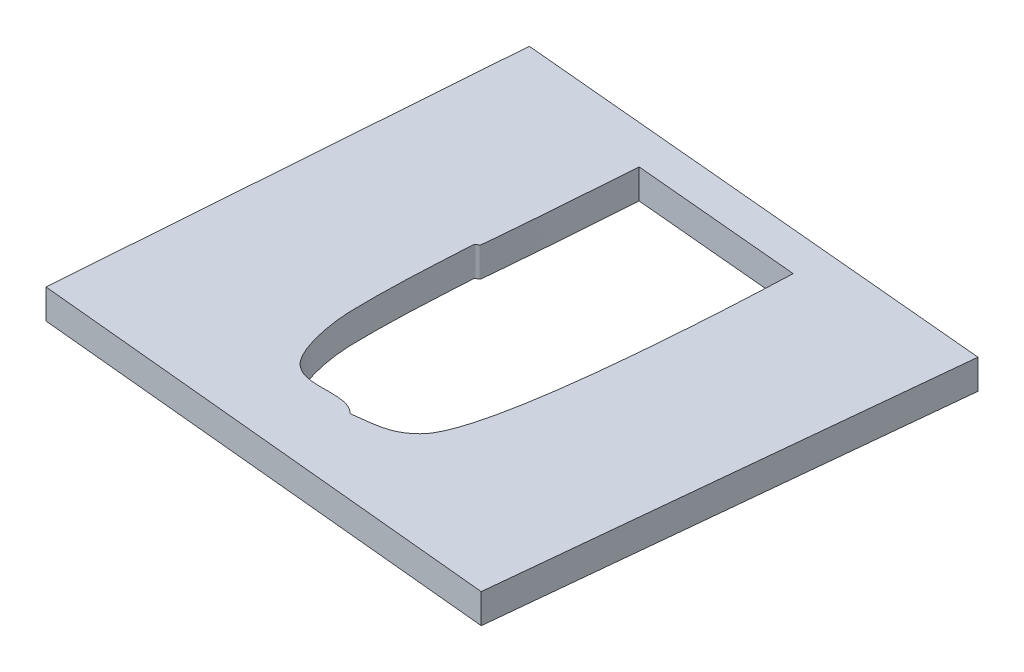
ISO-10303-21;
HEADER;
FILE_DESCRIPTION(('STEP AP214'),'2;1');
FILE_NAME('part.step','',(''),(''),'','','');
FILE_SCHEMA(('AUTOMOTIVE_DESIGN { 1 0 10303 214 1 1 1 1 }'));
ENDSEC;
DATA;
#1=APPLICATION_CONTEXT('core data for automotive mechanical design processes');
#2=APPLICATION_PROTOCOL_DEFINITION('international standard','automotive_design',2000,#1);
#3=PRODUCT_CONTEXT('',#1,'mechanical');
#4=PRODUCT('Part','Part','',(#3));
#5=PRODUCT_RELATED_PRODUCT_CATEGORY('part','',(#4));
#6=PRODUCT_DEFINITION_FORMATION('','',#4);
#7=PRODUCT_DEFINITION_CONTEXT('part definition',#1,'design');
#8=PRODUCT_DEFINITION('design','',#6,#7);
#9=PRODUCT_DEFINITION_SHAPE('','',#8);
#10=(LENGTH_UNIT() NAMED_UNIT(*) SI_UNIT(.MILLI.,.METRE.));
#11=(NAMED_UNIT(*) PLANE_ANGLE_UNIT() SI_UNIT($,.RADIAN.));
#12=(NAMED_UNIT(*) SI_UNIT($,.STERADIAN.) SOLID_ANGLE_UNIT());
#13=UNCERTAINTY_MEASURE_WITH_UNIT(LENGTH_MEASURE(1.E-05),#10,'distance_accuracy_value','');
#14=(GEOMETRIC_REPRESENTATION_CONTEXT(3) GLOBAL_UNCERTAINTY_ASSIGNED_CONTEXT((#13)) GLOBAL_UNIT_ASSIGNED_CONTEXT((#10,
#11,#12)) REPRESENTATION_CONTEXT('',''));
#15=CARTESIAN_POINT('',(0.,0.,0.));
#16=DIRECTION('',(0.,0.,1.));
#17=DIRECTION('',(1.,0.,0.));
#18=AXIS2_PLACEMENT_3D('',#15,#16,#17);
#19=CARTESIAN_POINT('',(64.8736828179978,1.,29.4803716712272));
#20=DIRECTION('',(0.997287156444047,0.,0.0736092901184895));
#21=DIRECTION('',(0.0736092901184895,0.,-0.997287156444047));
#22=AXIS2_PLACEMENT_3D('',#19,#20,#21);
#23=PLANE('',#22);
#24=DIRECTION('',(-0.0736092901184895,0.,0.997287156444047));
#25=VECTOR('',#24,1.);
#26=CARTESIAN_POINT('',(64.8736828179978,1.,29.4803716712272));
#27=LINE('',#26,#25);
#28=CARTESIAN_POINT('',(65.9980367068369,1.,14.2471899514714));
#29=VERTEX_POINT('',#28);
#30=CARTESIAN_POINT('',(64.8736828179978,1.,29.4803716712272));
#31=VERTEX_POINT('',#30);
#32=EDGE_CURVE('E159',#29,#31,#27,.T.);
#33=ORIENTED_EDGE('',*,*,#32,.F.);
#34=DIRECTION('',(0.,1.,0.));
#35=VECTOR('',#34,1.);
#36=CARTESIAN_POINT('',(65.9980367068369,-9.,14.2471899514714));
#37=LINE('',#36,#35);
#38=CARTESIAN_POINT('',(65.9980367068369,0.,14.2471899514714));
#39=VERTEX_POINT('',#38);
#40=EDGE_CURVE('E11',#39,#29,#37,.T.);
#41=ORIENTED_EDGE('',*,*,#40,.F.);
#42=DIRECTION('',(-0.0736092901184895,0.,0.997287156444047));
#43=VECTOR('',#42,1.);
#44=CARTESIAN_POINT('',(64.8736828179978,0.,29.4803716712272));
#45=LINE('',#44,#43);
#46=CARTESIAN_POINT('',(64.8736828179978,0.,29.4803716712272));
#47=VERTEX_POINT('',#46);
#48=EDGE_CURVE('E199',#39,#47,#45,.T.);
#49=ORIENTED_EDGE('',*,*,#48,.T.);
#50=DIRECTION('',(0.,-1.,0.));
#51=VECTOR('',#50,1.);
#52=CARTESIAN_POINT('',(64.8736828179978,1.,29.4803716712272));
#53=LINE('',#52,#51);
#54=EDGE_CURVE('E161',#31,#47,#53,.T.);
#55=ORIENTED_EDGE('',*,*,#54,.F.);
#56=EDGE_LOOP('',(#33,#41,#49,#55));
#57=FACE_BOUND('',#56,.T.);
#58=ADVANCED_FACE('F39',(#57),#23,.F.);
#59=CARTESIAN_POINT('',(86.6442561708785,1.,-23.4468904920636));
#60=DIRECTION('',(-0.994989942750527,0.,-0.0999750660179952));
#61=DIRECTION('',(-0.0999750660179952,0.,0.994989942750527));
#62=AXIS2_PLACEMENT_3D('',#59,#60,#61);
#63=PLANE('',#62);
#64=DIRECTION('',(0.0999750660179952,0.,-0.994989942750527));
#65=VECTOR('',#64,1.);
#66=CARTESIAN_POINT('',(86.6442561708785,0.,-23.4468904920636));
#67=LINE('',#66,#65);
#68=CARTESIAN_POINT('',(81.1690221539864,0.,31.0447242474821));
#69=VERTEX_POINT('',#68);
#70=CARTESIAN_POINT('',(82.7042116919124,0.,15.7659331319328));
#71=VERTEX_POINT('',#70);
#72=EDGE_CURVE('E202',#69,#71,#67,.T.);
#73=ORIENTED_EDGE('',*,*,#72,.T.);
#74=DIRECTION('',(0.,1.,0.));
#75=VECTOR('',#74,1.);
#76=CARTESIAN_POINT('',(82.7042116919124,-9.,15.7659331319328));
#77=LINE('',#76,#75);
#78=CARTESIAN_POINT('',(82.7042116919124,1.,15.7659331319328));
#79=VERTEX_POINT('',#78);
#80=EDGE_CURVE('E43',#71,#79,#77,.T.);
#81=ORIENTED_EDGE('',*,*,#80,.T.);
#82=DIRECTION('',(0.0999750660179952,0.,-0.994989942750527));
#83=VECTOR('',#82,1.);
#84=CARTESIAN_POINT('',(86.6442561708785,1.,-23.4468904920636));
#85=LINE('',#84,#83);
#86=CARTESIAN_POINT('',(81.1690221539864,1.,31.0447242474821));
#87=VERTEX_POINT('',#86);
#88=EDGE_CURVE('E169',#87,#79,#85,.T.);
#89=ORIENTED_EDGE('',*,*,#88,.F.);
#90=DIRECTION('',(0.,-1.,0.));
#91=VECTOR('',#90,1.);
#92=CARTESIAN_POINT('',(81.1690221539864,1.,31.0447242474821));
#93=LINE('',#92,#91);
#94=EDGE_CURVE('E165',#87,#69,#93,.T.);
#95=ORIENTED_EDGE('',*,*,#94,.T.);
#96=EDGE_LOOP('',(#73,#81,#89,#95));
#97=FACE_BOUND('',#96,.T.);
#98=ADVANCED_FACE('F41',(#97),#63,.F.);
#99=CARTESIAN_POINT('',(62.4947593620138,1.,-34.1363669338565));
#100=DIRECTION('',(0.,1.,0.));
#101=DIRECTION('',(0.,0.,1.));
#102=AXIS2_PLACEMENT_3D('',#99,#100,#101);
#103=PLANE('',#102);
#104=DIRECTION('',(0.995893206467704,0.,0.0905357460425184));
#105=VECTOR('',#104,1.);
#106=CARTESIAN_POINT('',(77.2581407133491,1.,15.2708357702452));
#107=LINE('',#106,#105);
#108=EDGE_CURVE('E73',#29,#79,#107,.T.);
#109=ORIENTED_EDGE('',*,*,#108,.F.);
#110=ORIENTED_EDGE('',*,*,#32,.T.);
#111=DIRECTION('',(0.995423607840516,0.,0.0955606663526895));
#112=VECTOR('',#111,1.);
#113=CARTESIAN_POINT('',(81.1690221539864,1.,31.0447242474821));
#114=LINE('',#113,#112);
#115=EDGE_CURVE('E164',#31,#87,#114,.T.);
#116=ORIENTED_EDGE('',*,*,#115,.T.);
#117=ORIENTED_EDGE('',*,*,#88,.T.);
#118=EDGE_LOOP('',(#109,#110,#116,#117));
#119=FACE_BOUND('',#118,.T.);
#120=CARTESIAN_POINT('',(73.7383474167756,1.,28.0463818096602));
#121=CARTESIAN_POINT('',(74.426505222727,1.,27.9480735516672));
#122=CARTESIAN_POINT('',(75.0353706972129,1.,27.9754284339334));
#123=CARTESIAN_POINT('',(75.5634254224063,1.,27.3945682362207));
#124=CARTESIAN_POINT('',(76.8293852911814,1.,26.0020123805681));
#125=CARTESIAN_POINT('',(77.1136999415976,1.,16.6411930013271));
#126=CARTESIAN_POINT('',(77.1277779986612,1.,16.4441002024364));
#127=B_SPLINE_CURVE_WITH_KNOTS('',3,(#120,#121,#122,#123,#124,#125,#126),.UNSPECIFIED.,.F.,.F.,
(4,3,4),(0.,1.,2.),.UNSPECIFIED.);
#128=CARTESIAN_POINT('',(73.7383474167756,1.,28.0463818096602));
#129=VERTEX_POINT('',#128);
#130=CARTESIAN_POINT('',(77.1277779986612,1.,16.4441002024364));
#131=VERTEX_POINT('',#130);
#132=EDGE_CURVE('E120',#129,#131,#127,.T.);
#133=ORIENTED_EDGE('',*,*,#132,.F.);
#134=CARTESIAN_POINT('',(71.3918185523932,1.,15.9226493436847));
#135=CARTESIAN_POINT('',(71.2614558377053,1.,17.5739103963983));
#136=CARTESIAN_POINT('',(71.1697309146279,1.,19.2286775654163));
#137=CARTESIAN_POINT('',(71.0007304083295,1.,20.8764325018253));
#138=CARTESIAN_POINT('',(70.9944603699907,1.,20.9375653756282));
#139=CARTESIAN_POINT('',(70.8742010622063,1.,20.9454613194772));
#140=CARTESIAN_POINT('',(70.8703676936416,1.,21.0067952165132));
#141=CARTESIAN_POINT('',(70.786295357525,1.,22.3519525943785));
#142=CARTESIAN_POINT('',(70.7086696821393,1.,23.7006216088193));
#143=CARTESIAN_POINT('',(70.7400049789537,1.,25.0480393718383));
#144=CARTESIAN_POINT('',(70.7525170348158,1.,25.5860577739106));
#145=CARTESIAN_POINT('',(70.9276062432311,1.,26.8640398828926));
#146=CARTESIAN_POINT('',(71.3918185523932,1.,27.3945682362207));
#147=CARTESIAN_POINT('',(72.0164694172351,1.,28.1084549388972));
#148=CARTESIAN_POINT('',(73.1324829929566,1.,27.4405173858413));
#149=CARTESIAN_POINT('',(73.7383474167756,1.,28.0463818096602));
#150=B_SPLINE_CURVE_WITH_KNOTS('',3,(#134,#135,#136,#137,#138,#139,#140,#141,#142,#143,#144,
#145,#146,#147,#148,#149),.UNSPECIFIED.,.F.,.F.,(4,3,3,3,3,4),(0.,1.,2.,3.,4.,5.),.UNSPECIFIED.);
#151=CARTESIAN_POINT('',(71.3918185523932,1.,15.9226493436847));
#152=VERTEX_POINT('',#151);
#153=EDGE_CURVE('E109',#152,#129,#150,.T.);
#154=ORIENTED_EDGE('',*,*,#153,.F.);
#155=DIRECTION('',(-0.995893206467704,0.,-0.0905357460425187));
#156=VECTOR('',#155,1.);
#157=CARTESIAN_POINT('',(71.3918185523932,1.,15.9226493436847));
#158=LINE('',#157,#156);
#159=EDGE_CURVE('E80',#131,#152,#158,.T.);
#160=ORIENTED_EDGE('',*,*,#159,.F.);
#161=EDGE_LOOP('',(#133,#154,#160));
#162=FACE_BOUND('',#161,.T.);
#163=ADVANCED_FACE('F125',(#119,#162),#103,.T.);
#164=CARTESIAN_POINT('',(62.4947593620138,0.,-34.1363669338565));
#165=DIRECTION('',(0.,1.,0.));
#166=DIRECTION('',(0.,0.,1.));
#167=AXIS2_PLACEMENT_3D('',#164,#165,#166);
#168=PLANE('',#167);
#169=CARTESIAN_POINT('',(71.3918185523932,0.,15.9226493436847));
#170=CARTESIAN_POINT('',(71.2614558377053,0.,17.5739103963983));
#171=CARTESIAN_POINT('',(71.1697309146279,0.,19.2286775654163));
#172=CARTESIAN_POINT('',(71.0007304083295,0.,20.8764325018253));
#173=CARTESIAN_POINT('',(70.9944603699907,0.,20.9375653756282));
#174=CARTESIAN_POINT('',(70.8742010622063,0.,20.9454613194772));
#175=CARTESIAN_POINT('',(70.8703676936416,0.,21.0067952165132));
#176=CARTESIAN_POINT('',(70.786295357525,0.,22.3519525943785));
#177=CARTESIAN_POINT('',(70.7086696821393,0.,23.7006216088193));
#178=CARTESIAN_POINT('',(70.7400049789537,0.,25.0480393718383));
#179=CARTESIAN_POINT('',(70.7525170348158,0.,25.5860577739106));
#180=CARTESIAN_POINT('',(70.9276062432311,0.,26.8640398828926));
#181=CARTESIAN_POINT('',(71.3918185523932,0.,27.3945682362207));
#182=CARTESIAN_POINT('',(72.0164694172351,0.,28.1084549388972));
#183=CARTESIAN_POINT('',(73.1324829929566,0.,27.4405173858413));
#184=CARTESIAN_POINT('',(73.7383474167756,0.,28.0463818096602));
#185=B_SPLINE_CURVE_WITH_KNOTS('',3,(#169,#170,#171,#172,#173,#174,#175,#176,#177,#178,#179,
#180,#181,#182,#183,#184),.UNSPECIFIED.,.F.,.F.,(4,3,3,3,3,4),(0.,1.,2.,3.,4.,5.),.UNSPECIFIED.);
#186=CARTESIAN_POINT('',(71.3918185523932,0.,15.9226493436847));
#187=VERTEX_POINT('',#186);
#188=CARTESIAN_POINT('',(73.7383474167756,0.,28.0463818096602));
#189=VERTEX_POINT('',#188);
#190=EDGE_CURVE('E106',#187,#189,#185,.T.);
#191=ORIENTED_EDGE('',*,*,#190,.T.);
#192=CARTESIAN_POINT('',(73.7383474167756,0.,28.0463818096602));
#193=CARTESIAN_POINT('',(74.426505222727,0.,27.9480735516672));
#194=CARTESIAN_POINT('',(75.0353706972129,0.,27.9754284339334));
#195=CARTESIAN_POINT('',(75.5634254224063,0.,27.3945682362207));
#196=CARTESIAN_POINT('',(76.8293852911814,0.,26.0020123805681));
#197=CARTESIAN_POINT('',(77.1136999415976,0.,16.6411930013271));
#198=CARTESIAN_POINT('',(77.1277779986612,0.,16.4441002024364));
#199=B_SPLINE_CURVE_WITH_KNOTS('',3,(#192,#193,#194,#195,#196,#197,#198),.UNSPECIFIED.,.F.,.F.,
(4,3,4),(0.,1.,2.),.UNSPECIFIED.);
#200=CARTESIAN_POINT('',(77.1277779986612,0.,16.4441002024364));
#201=VERTEX_POINT('',#200);
#202=EDGE_CURVE('E122',#189,#201,#199,.T.);
#203=ORIENTED_EDGE('',*,*,#202,.T.);
#204=DIRECTION('',(-0.995893206467704,0.,-0.0905357460425187));
#205=VECTOR('',#204,1.);
#206=CARTESIAN_POINT('',(71.3918185523932,0.,15.9226493436847));
#207=LINE('',#206,#205);
#208=EDGE_CURVE('E179',#201,#187,#207,.T.);
#209=ORIENTED_EDGE('',*,*,#208,.T.);
#210=EDGE_LOOP('',(#191,#203,#209));
#211=FACE_BOUND('',#210,.T.);
#212=ORIENTED_EDGE('',*,*,#48,.F.);
#213=DIRECTION('',(0.995893206467704,0.,0.090535746042519));
#214=VECTOR('',#213,1.);
#215=CARTESIAN_POINT('',(58.1610228997696,0.,13.5347341508289));
#216=LINE('',#215,#214);
#217=EDGE_CURVE('E58',#39,#71,#216,.T.);
#218=ORIENTED_EDGE('',*,*,#217,.T.);
#219=ORIENTED_EDGE('',*,*,#72,.F.);
#220=DIRECTION('',(0.995423607840516,0.,0.0955606663526895));
#221=VECTOR('',#220,1.);
#222=CARTESIAN_POINT('',(81.1690221539864,0.,31.0447242474821));
#223=LINE('',#222,#221);
#224=EDGE_CURVE('E203',#47,#69,#223,.T.);
#225=ORIENTED_EDGE('',*,*,#224,.F.);
#226=EDGE_LOOP('',(#212,#218,#219,#225));
#227=FACE_BOUND('',#226,.T.);
#228=ADVANCED_FACE('F214',(#211,#227),#168,.F.);
#229=CARTESIAN_POINT('',(81.1690221539864,1.,31.0447242474821));
#230=DIRECTION('',(0.0955606663526895,0.,-0.995423607840516));
#231=DIRECTION('',(-0.995423607840516,0.,-0.0955606663526896));
#232=AXIS2_PLACEMENT_3D('',#229,#230,#231);
#233=PLANE('',#232);
#234=ORIENTED_EDGE('',*,*,#224,.T.);
#235=ORIENTED_EDGE('',*,*,#94,.F.);
#236=ORIENTED_EDGE('',*,*,#115,.F.);
#237=ORIENTED_EDGE('',*,*,#54,.T.);
#238=EDGE_LOOP('',(#234,#235,#236,#237));
#239=FACE_BOUND('',#238,.T.);
#240=ADVANCED_FACE('F212',(#239),#233,.F.);
#241=CARTESIAN_POINT('',(77.2581407133491,1.,15.2708357702452));
#242=DIRECTION('',(0.0905357460425184,0.,-0.995893206467704));
#243=DIRECTION('',(-0.995893206467704,0.,-0.0905357460425184));
#244=AXIS2_PLACEMENT_3D('',#241,#242,#243);
#245=PLANE('',#244);
#246=ORIENTED_EDGE('',*,*,#80,.F.);
#247=ORIENTED_EDGE('',*,*,#217,.F.);
#248=ORIENTED_EDGE('',*,*,#40,.T.);
#249=ORIENTED_EDGE('',*,*,#108,.T.);
#250=EDGE_LOOP('',(#246,#247,#248,#249));
#251=FACE_BOUND('',#250,.T.);
#252=ADVANCED_FACE('F217',(#251),#245,.T.);
#253=DIRECTION('',(0.,-1.,0.));
#254=VECTOR('',#253,1.);
#255=SURFACE_OF_LINEAR_EXTRUSION('',#150,#254);
#256=ORIENTED_EDGE('',*,*,#190,.F.);
#257=DIRECTION('',(0.,-1.,0.));
#258=VECTOR('',#257,1.);
#259=CARTESIAN_POINT('',(71.3918185523932,1.,15.9226493436847));
#260=LINE('',#259,#258);
#261=EDGE_CURVE('E50',#152,#187,#260,.T.);
#262=ORIENTED_EDGE('',*,*,#261,.F.);
#263=ORIENTED_EDGE('',*,*,#153,.T.);
#264=DIRECTION('',(0.,-1.,0.));
#265=VECTOR('',#264,1.);
#266=CARTESIAN_POINT('',(73.7383474167756,1.,28.0463818096602));
#267=LINE('',#266,#265);
#268=EDGE_CURVE('E112',#129,#189,#267,.T.);
#269=ORIENTED_EDGE('',*,*,#268,.T.);
#270=EDGE_LOOP('',(#256,#262,#263,#269));
#271=FACE_BOUND('',#270,.T.);
#272=ADVANCED_FACE('F111',(#271),#255,.T.);
#273=DIRECTION('',(0.,-1.,0.));
#274=VECTOR('',#273,1.);
#275=SURFACE_OF_LINEAR_EXTRUSION('',#127,#274);
#276=ORIENTED_EDGE('',*,*,#202,.F.);
#277=ORIENTED_EDGE('',*,*,#268,.F.);
#278=ORIENTED_EDGE('',*,*,#132,.T.);
#279=DIRECTION('',(0.,-1.,0.));
#280=VECTOR('',#279,1.);
#281=CARTESIAN_POINT('',(77.1277779986612,1.,16.4441002024364));
#282=LINE('',#281,#280);
#283=EDGE_CURVE('E127',#131,#201,#282,.T.);
#284=ORIENTED_EDGE('',*,*,#283,.T.);
#285=EDGE_LOOP('',(#276,#277,#278,#284));
#286=FACE_BOUND('',#285,.T.);
#287=ADVANCED_FACE('F119',(#286),#275,.T.);
#288=CARTESIAN_POINT('',(71.3918185523932,1.,15.9226493436847));
#289=DIRECTION('',(-0.0905357460425187,0.,0.995893206467704));
#290=DIRECTION('',(0.995893206467704,0.,0.0905357460425187));
#291=AXIS2_PLACEMENT_3D('',#288,#289,#290);
#292=PLANE('',#291);
#293=ORIENTED_EDGE('',*,*,#208,.F.);
#294=ORIENTED_EDGE('',*,*,#283,.F.);
#295=ORIENTED_EDGE('',*,*,#159,.T.);
#296=ORIENTED_EDGE('',*,*,#261,.T.);
#297=EDGE_LOOP('',(#293,#294,#295,#296));
#298=FACE_BOUND('',#297,.T.);
#299=ADVANCED_FACE('F147',(#298),#292,.T.);
#300=CLOSED_SHELL('',(#58,#98,#163,#228,#240,#252,#272,#287,#299));
#301=MANIFOLD_SOLID_BREP('B2',#300);
#302=ADVANCED_BREP_SHAPE_REPRESENTATION('',(#18,#301),#14);
#303=SHAPE_DEFINITION_REPRESENTATION(#9,#302);
ENDSEC;
END-ISO-10303-21;
